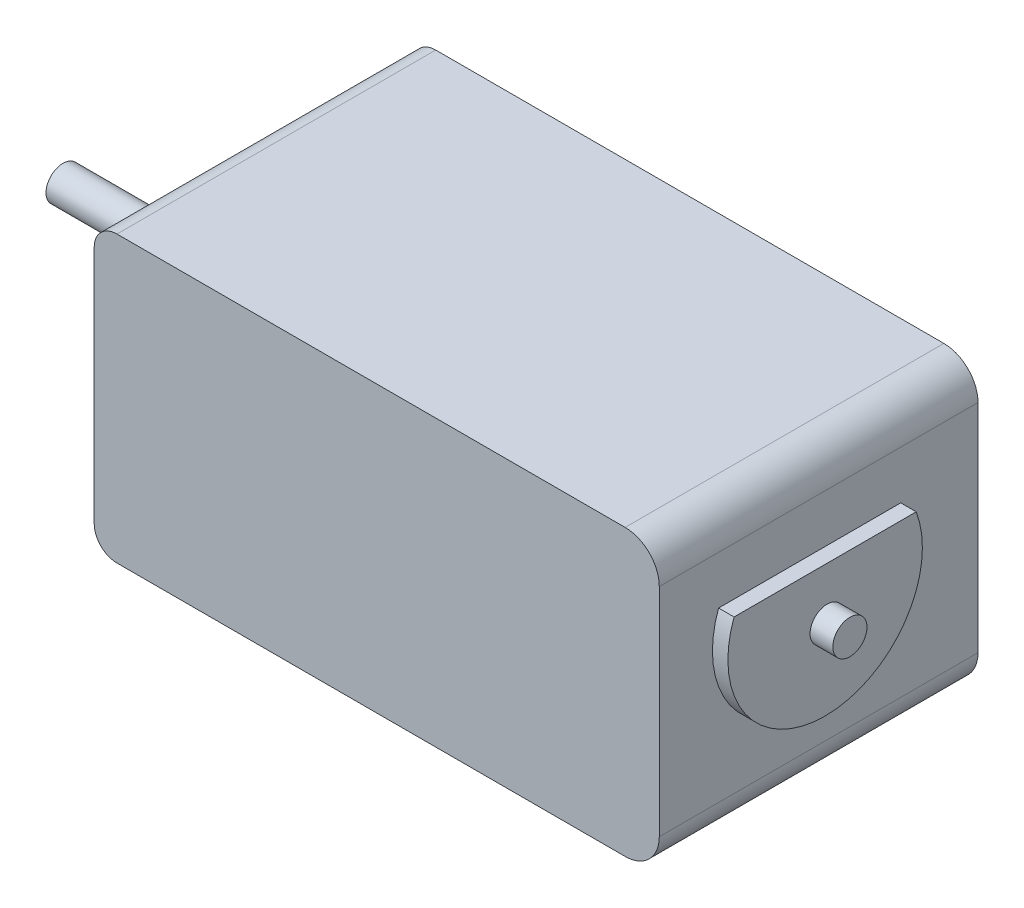
ISO-10303-21;
HEADER;
FILE_DESCRIPTION(('STEP AP214'),'2;1');
FILE_NAME('part.step','',(''),(''),'','','');
FILE_SCHEMA(('AUTOMOTIVE_DESIGN { 1 0 10303 214 1 1 1 1 }'));
ENDSEC;
DATA;
#1=APPLICATION_CONTEXT('core data for automotive mechanical design processes');
#2=APPLICATION_PROTOCOL_DEFINITION('international standard','automotive_design',2000,#1);
#3=PRODUCT_CONTEXT('',#1,'mechanical');
#4=PRODUCT('Part','Part','',(#3));
#5=PRODUCT_RELATED_PRODUCT_CATEGORY('part','',(#4));
#6=PRODUCT_DEFINITION_FORMATION('','',#4);
#7=PRODUCT_DEFINITION_CONTEXT('part definition',#1,'design');
#8=PRODUCT_DEFINITION('design','',#6,#7);
#9=PRODUCT_DEFINITION_SHAPE('','',#8);
#10=(LENGTH_UNIT() NAMED_UNIT(*) SI_UNIT(.MILLI.,.METRE.));
#11=(NAMED_UNIT(*) PLANE_ANGLE_UNIT() SI_UNIT($,.RADIAN.));
#12=(NAMED_UNIT(*) SI_UNIT($,.STERADIAN.) SOLID_ANGLE_UNIT());
#13=UNCERTAINTY_MEASURE_WITH_UNIT(LENGTH_MEASURE(1.E-05),#10,'distance_accuracy_value','');
#14=(GEOMETRIC_REPRESENTATION_CONTEXT(3) GLOBAL_UNCERTAINTY_ASSIGNED_CONTEXT((#13)) GLOBAL_UNIT_ASSIGNED_CONTEXT((#10,
#11,#12)) REPRESENTATION_CONTEXT('',''));
#15=CARTESIAN_POINT('',(0.,0.,0.));
#16=DIRECTION('',(0.,0.,1.));
#17=DIRECTION('',(1.,0.,0.));
#18=AXIS2_PLACEMENT_3D('',#15,#16,#17);
#19=CARTESIAN_POINT('',(24.8208983265812,-1.5,14.));
#20=DIRECTION('',(-1.,0.,0.));
#21=DIRECTION('',(0.,0.,1.));
#22=AXIS2_PLACEMENT_3D('',#19,#20,#21);
#23=PLANE('',#22);
#24=DIRECTION('',(0.,1.,0.));
#25=VECTOR('',#24,1.);
#26=CARTESIAN_POINT('',(24.8208983265812,-1.5,0.));
#27=LINE('',#26,#25);
#28=CARTESIAN_POINT('',(24.8208983265812,-11.0169927155581,0.));
#29=VERTEX_POINT('',#28);
#30=CARTESIAN_POINT('',(24.8208983265812,-1.5,0.));
#31=VERTEX_POINT('',#30);
#32=EDGE_CURVE('E134',#29,#31,#27,.T.);
#33=ORIENTED_EDGE('',*,*,#32,.T.);
#34=DIRECTION('',(0.,0.,-1.));
#35=VECTOR('',#34,1.);
#36=CARTESIAN_POINT('',(24.8208983265812,-1.5,14.));
#37=LINE('',#36,#35);
#38=CARTESIAN_POINT('',(24.8208983265812,-1.5,14.));
#39=VERTEX_POINT('',#38);
#40=EDGE_CURVE('E131',#39,#31,#37,.T.);
#41=ORIENTED_EDGE('',*,*,#40,.F.);
#42=DIRECTION('',(0.,1.,0.));
#43=VECTOR('',#42,1.);
#44=CARTESIAN_POINT('',(24.8208983265812,-1.5,14.));
#45=LINE('',#44,#43);
#46=CARTESIAN_POINT('',(24.8208983265812,-11.0169927155581,14.));
#47=VERTEX_POINT('',#46);
#48=EDGE_CURVE('E118',#47,#39,#45,.T.);
#49=ORIENTED_EDGE('',*,*,#48,.F.);
#50=DIRECTION('',(0.,0.,-1.));
#51=VECTOR('',#50,1.);
#52=CARTESIAN_POINT('',(24.8208983265812,-11.0169927155581,14.));
#53=LINE('',#52,#51);
#54=EDGE_CURVE('E137',#47,#29,#53,.T.);
#55=ORIENTED_EDGE('',*,*,#54,.T.);
#56=EDGE_LOOP('',(#33,#41,#49,#55));
#57=FACE_BOUND('',#56,.T.);
#58=CARTESIAN_POINT('',(24.8208983265812,-5.11818006161583,7.39390366159449));
#59=DIRECTION('',(-1.,0.,0.));
#60=DIRECTION('',(0.,0.,1.));
#61=AXIS2_PLACEMENT_3D('',#58,#59,#60);
#62=CIRCLE('',#61,4.271792058218);
#63=CARTESIAN_POINT('',(24.8208983265812,-3.62022901041665,11.3944473792491));
#64=VERTEX_POINT('',#63);
#65=CARTESIAN_POINT('',(24.8208983265812,-3.62022901041665,3.3933599439399));
#66=VERTEX_POINT('',#65);
#67=EDGE_CURVE('E12',#64,#66,#62,.F.);
#68=ORIENTED_EDGE('',*,*,#67,.F.);
#69=DIRECTION('',(0.,0.,-1.));
#70=VECTOR('',#69,1.);
#71=CARTESIAN_POINT('',(24.8208983265812,-3.62022901041665,14.));
#72=LINE('',#71,#70);
#73=EDGE_CURVE('E46',#64,#66,#72,.T.);
#74=ORIENTED_EDGE('',*,*,#73,.T.);
#75=EDGE_LOOP('',(#68,#74));
#76=FACE_BOUND('',#75,.T.);
#77=ADVANCED_FACE('F38',(#57,#76),#23,.F.);
#78=CARTESIAN_POINT('',(1.,-1.,14.));
#79=DIRECTION('',(0.,0.,-1.));
#80=DIRECTION('',(-1.,0.,0.));
#81=AXIS2_PLACEMENT_3D('',#78,#79,#80);
#82=CYLINDRICAL_SURFACE('',#81,1.);
#83=CARTESIAN_POINT('',(1.,-1.,0.));
#84=DIRECTION('',(0.,0.,1.));
#85=DIRECTION('',(-1.,0.,0.));
#86=AXIS2_PLACEMENT_3D('',#83,#84,#85);
#87=CIRCLE('',#86,1.);
#88=CARTESIAN_POINT('',(1.00000000000001,0.,0.));
#89=VERTEX_POINT('',#88);
#90=CARTESIAN_POINT('',(0.,-1.00000000000001,0.));
#91=VERTEX_POINT('',#90);
#92=EDGE_CURVE('E146',#89,#91,#87,.T.);
#93=ORIENTED_EDGE('',*,*,#92,.T.);
#94=DIRECTION('',(0.,0.,-1.));
#95=VECTOR('',#94,1.);
#96=CARTESIAN_POINT('',(0.,-1.00000000000001,14.));
#97=LINE('',#96,#95);
#98=CARTESIAN_POINT('',(0.,-1.00000000000001,14.));
#99=VERTEX_POINT('',#98);
#100=EDGE_CURVE('E175',#99,#91,#97,.T.);
#101=ORIENTED_EDGE('',*,*,#100,.F.);
#102=CARTESIAN_POINT('',(1.,-1.,14.));
#103=DIRECTION('',(0.,0.,1.));
#104=DIRECTION('',(-1.,0.,0.));
#105=AXIS2_PLACEMENT_3D('',#102,#103,#104);
#106=CIRCLE('',#105,1.);
#107=CARTESIAN_POINT('',(1.00000000000001,0.,14.));
#108=VERTEX_POINT('',#107);
#109=EDGE_CURVE('E162',#108,#99,#106,.T.);
#110=ORIENTED_EDGE('',*,*,#109,.F.);
#111=DIRECTION('',(0.,0.,-1.));
#112=VECTOR('',#111,1.);
#113=CARTESIAN_POINT('',(1.00000000000001,0.,14.));
#114=LINE('',#113,#112);
#115=EDGE_CURVE('E142',#108,#89,#114,.T.);
#116=ORIENTED_EDGE('',*,*,#115,.T.);
#117=EDGE_LOOP('',(#93,#101,#110,#116));
#118=FACE_BOUND('',#117,.T.);
#119=ADVANCED_FACE('F40',(#118),#82,.T.);
#120=CARTESIAN_POINT('',(0.,-1.00000000000001,14.));
#121=DIRECTION('',(1.,0.,0.));
#122=DIRECTION('',(0.,0.,-1.));
#123=AXIS2_PLACEMENT_3D('',#120,#121,#122);
#124=PLANE('',#123);
#125=CARTESIAN_POINT('',(0.,-5.87228384255916,7.36782144306665));
#126=DIRECTION('',(1.,0.,0.));
#127=DIRECTION('',(0.,0.,-1.));
#128=AXIS2_PLACEMENT_3D('',#125,#126,#127);
#129=CIRCLE('',#128,2.5);
#130=CARTESIAN_POINT('',(0.,-5.87228384255916,4.86782144306665));
#131=VERTEX_POINT('',#130);
#132=EDGE_CURVE('E207',#131,#131,#129,.T.);
#133=ORIENTED_EDGE('',*,*,#132,.T.);
#134=EDGE_LOOP('',(#133));
#135=FACE_BOUND('',#134,.T.);
#136=DIRECTION('',(0.,-1.,0.));
#137=VECTOR('',#136,1.);
#138=CARTESIAN_POINT('',(0.,-1.00000000000001,0.));
#139=LINE('',#138,#137);
#140=CARTESIAN_POINT('',(0.,-11.5169927155581,0.));
#141=VERTEX_POINT('',#140);
#142=EDGE_CURVE('E149',#91,#141,#139,.T.);
#143=ORIENTED_EDGE('',*,*,#142,.T.);
#144=DIRECTION('',(0.,0.,-1.));
#145=VECTOR('',#144,1.);
#146=CARTESIAN_POINT('',(0.,-11.5169927155581,14.));
#147=LINE('',#146,#145);
#148=CARTESIAN_POINT('',(0.,-11.5169927155581,14.));
#149=VERTEX_POINT('',#148);
#150=EDGE_CURVE('E172',#149,#141,#147,.T.);
#151=ORIENTED_EDGE('',*,*,#150,.F.);
#152=DIRECTION('',(0.,-1.,0.));
#153=VECTOR('',#152,1.);
#154=CARTESIAN_POINT('',(0.,-1.00000000000001,14.));
#155=LINE('',#154,#153);
#156=EDGE_CURVE('E103',#99,#149,#155,.T.);
#157=ORIENTED_EDGE('',*,*,#156,.F.);
#158=ORIENTED_EDGE('',*,*,#100,.T.);
#159=EDGE_LOOP('',(#143,#151,#157,#158));
#160=FACE_BOUND('',#159,.T.);
#161=ADVANCED_FACE('F234',(#135,#160),#124,.F.);
#162=CARTESIAN_POINT('',(1.,-11.5169927155581,14.));
#163=DIRECTION('',(0.,0.,-1.));
#164=DIRECTION('',(-1.,0.,0.));
#165=AXIS2_PLACEMENT_3D('',#162,#163,#164);
#166=CYLINDRICAL_SURFACE('',#165,1.);
#167=CARTESIAN_POINT('',(1.,-11.5169927155581,0.));
#168=DIRECTION('',(0.,0.,1.));
#169=DIRECTION('',(-1.,0.,0.));
#170=AXIS2_PLACEMENT_3D('',#167,#168,#169);
#171=CIRCLE('',#170,1.);
#172=CARTESIAN_POINT('',(1.00000000000001,-12.5169927155581,0.));
#173=VERTEX_POINT('',#172);
#174=EDGE_CURVE('E152',#141,#173,#171,.T.);
#175=ORIENTED_EDGE('',*,*,#174,.T.);
#176=DIRECTION('',(0.,0.,-1.));
#177=VECTOR('',#176,1.);
#178=CARTESIAN_POINT('',(1.00000000000001,-12.5169927155581,14.));
#179=LINE('',#178,#177);
#180=CARTESIAN_POINT('',(1.00000000000001,-12.5169927155581,14.));
#181=VERTEX_POINT('',#180);
#182=EDGE_CURVE('E169',#181,#173,#179,.T.);
#183=ORIENTED_EDGE('',*,*,#182,.F.);
#184=CARTESIAN_POINT('',(1.,-11.5169927155581,14.));
#185=DIRECTION('',(0.,0.,1.));
#186=DIRECTION('',(-1.,0.,0.));
#187=AXIS2_PLACEMENT_3D('',#184,#185,#186);
#188=CIRCLE('',#187,1.);
#189=EDGE_CURVE('E214',#149,#181,#188,.T.);
#190=ORIENTED_EDGE('',*,*,#189,.F.);
#191=ORIENTED_EDGE('',*,*,#150,.T.);
#192=EDGE_LOOP('',(#175,#183,#190,#191));
#193=FACE_BOUND('',#192,.T.);
#194=ADVANCED_FACE('F237',(#193),#166,.T.);
#195=CARTESIAN_POINT('',(1.00000000000001,-12.5169927155581,14.));
#196=DIRECTION('',(0.,1.,0.));
#197=DIRECTION('',(-1.,0.,0.));
#198=AXIS2_PLACEMENT_3D('',#195,#196,#197);
#199=PLANE('',#198);
#200=DIRECTION('',(1.,0.,0.));
#201=VECTOR('',#200,1.);
#202=CARTESIAN_POINT('',(1.00000000000001,-12.5169927155581,0.));
#203=LINE('',#202,#201);
#204=CARTESIAN_POINT('',(23.3208983265812,-12.5169927155581,0.));
#205=VERTEX_POINT('',#204);
#206=EDGE_CURVE('E154',#173,#205,#203,.T.);
#207=ORIENTED_EDGE('',*,*,#206,.T.);
#208=DIRECTION('',(0.,0.,-1.));
#209=VECTOR('',#208,1.);
#210=CARTESIAN_POINT('',(23.3208983265812,-12.5169927155581,14.));
#211=LINE('',#210,#209);
#212=CARTESIAN_POINT('',(23.3208983265812,-12.5169927155581,14.));
#213=VERTEX_POINT('',#212);
#214=EDGE_CURVE('E166',#213,#205,#211,.T.);
#215=ORIENTED_EDGE('',*,*,#214,.F.);
#216=DIRECTION('',(1.,0.,0.));
#217=VECTOR('',#216,1.);
#218=CARTESIAN_POINT('',(1.00000000000001,-12.5169927155581,14.));
#219=LINE('',#218,#217);
#220=EDGE_CURVE('E216',#181,#213,#219,.T.);
#221=ORIENTED_EDGE('',*,*,#220,.F.);
#222=ORIENTED_EDGE('',*,*,#182,.T.);
#223=EDGE_LOOP('',(#207,#215,#221,#222));
#224=FACE_BOUND('',#223,.T.);
#225=ADVANCED_FACE('F222',(#224),#199,.F.);
#226=CARTESIAN_POINT('',(23.3208983265812,-11.0169927155581,14.));
#227=DIRECTION('',(0.,0.,-1.));
#228=DIRECTION('',(-1.,0.,0.));
#229=AXIS2_PLACEMENT_3D('',#226,#227,#228);
#230=CYLINDRICAL_SURFACE('',#229,1.5);
#231=CARTESIAN_POINT('',(23.3208983265812,-11.0169927155581,0.));
#232=DIRECTION('',(0.,0.,1.));
#233=DIRECTION('',(1.,0.,0.));
#234=AXIS2_PLACEMENT_3D('',#231,#232,#233);
#235=CIRCLE('',#234,1.5);
#236=EDGE_CURVE('E156',#205,#29,#235,.T.);
#237=ORIENTED_EDGE('',*,*,#236,.T.);
#238=ORIENTED_EDGE('',*,*,#54,.F.);
#239=CARTESIAN_POINT('',(23.3208983265812,-11.0169927155581,14.));
#240=DIRECTION('',(0.,0.,1.));
#241=DIRECTION('',(1.,0.,0.));
#242=AXIS2_PLACEMENT_3D('',#239,#240,#241);
#243=CIRCLE('',#242,1.5);
#244=EDGE_CURVE('E125',#213,#47,#243,.T.);
#245=ORIENTED_EDGE('',*,*,#244,.F.);
#246=ORIENTED_EDGE('',*,*,#214,.T.);
#247=EDGE_LOOP('',(#237,#238,#245,#246));
#248=FACE_BOUND('',#247,.T.);
#249=ADVANCED_FACE('F226',(#248),#230,.T.);
#250=CARTESIAN_POINT('',(23.3208983265812,-1.5,14.));
#251=DIRECTION('',(0.,0.,-1.));
#252=DIRECTION('',(-1.,0.,0.));
#253=AXIS2_PLACEMENT_3D('',#250,#251,#252);
#254=CYLINDRICAL_SURFACE('',#253,1.5);
#255=CARTESIAN_POINT('',(23.3208983265812,-1.5,0.));
#256=DIRECTION('',(0.,0.,1.));
#257=DIRECTION('',(1.,0.,0.));
#258=AXIS2_PLACEMENT_3D('',#255,#256,#257);
#259=CIRCLE('',#258,1.5);
#260=CARTESIAN_POINT('',(23.3208983265812,0.,0.));
#261=VERTEX_POINT('',#260);
#262=EDGE_CURVE('E159',#31,#261,#259,.T.);
#263=ORIENTED_EDGE('',*,*,#262,.T.);
#264=DIRECTION('',(0.,0.,-1.));
#265=VECTOR('',#264,1.);
#266=CARTESIAN_POINT('',(23.3208983265812,0.,14.));
#267=LINE('',#266,#265);
#268=CARTESIAN_POINT('',(23.3208983265812,0.,14.));
#269=VERTEX_POINT('',#268);
#270=EDGE_CURVE('E138',#269,#261,#267,.T.);
#271=ORIENTED_EDGE('',*,*,#270,.F.);
#272=CARTESIAN_POINT('',(23.3208983265812,-1.5,14.));
#273=DIRECTION('',(0.,0.,1.));
#274=DIRECTION('',(1.,0.,0.));
#275=AXIS2_PLACEMENT_3D('',#272,#273,#274);
#276=CIRCLE('',#275,1.5);
#277=EDGE_CURVE('E122',#39,#269,#276,.T.);
#278=ORIENTED_EDGE('',*,*,#277,.F.);
#279=ORIENTED_EDGE('',*,*,#40,.T.);
#280=EDGE_LOOP('',(#263,#271,#278,#279));
#281=FACE_BOUND('',#280,.T.);
#282=ADVANCED_FACE('F140',(#281),#254,.T.);
#283=CARTESIAN_POINT('',(1.00000000000001,0.,14.));
#284=DIRECTION('',(0.,-1.,0.));
#285=DIRECTION('',(0.,0.,-1.));
#286=AXIS2_PLACEMENT_3D('',#283,#284,#285);
#287=PLANE('',#286);
#288=DIRECTION('',(-1.,0.,0.));
#289=VECTOR('',#288,1.);
#290=CARTESIAN_POINT('',(1.00000000000001,0.,0.));
#291=LINE('',#290,#289);
#292=EDGE_CURVE('E94',#261,#89,#291,.T.);
#293=ORIENTED_EDGE('',*,*,#292,.T.);
#294=ORIENTED_EDGE('',*,*,#115,.F.);
#295=DIRECTION('',(-1.,0.,0.));
#296=VECTOR('',#295,1.);
#297=CARTESIAN_POINT('',(1.00000000000001,0.,14.));
#298=LINE('',#297,#296);
#299=EDGE_CURVE('E61',#269,#108,#298,.T.);
#300=ORIENTED_EDGE('',*,*,#299,.F.);
#301=ORIENTED_EDGE('',*,*,#270,.T.);
#302=EDGE_LOOP('',(#293,#294,#300,#301));
#303=FACE_BOUND('',#302,.T.);
#304=ADVANCED_FACE('F230',(#303),#287,.F.);
#305=CARTESIAN_POINT('',(1.,-1.,14.));
#306=DIRECTION('',(0.,0.,-1.));
#307=DIRECTION('',(-1.,0.,0.));
#308=AXIS2_PLACEMENT_3D('',#305,#306,#307);
#309=PLANE('',#308);
#310=ORIENTED_EDGE('',*,*,#109,.T.);
#311=ORIENTED_EDGE('',*,*,#156,.T.);
#312=ORIENTED_EDGE('',*,*,#189,.T.);
#313=ORIENTED_EDGE('',*,*,#220,.T.);
#314=ORIENTED_EDGE('',*,*,#244,.T.);
#315=ORIENTED_EDGE('',*,*,#48,.T.);
#316=ORIENTED_EDGE('',*,*,#277,.T.);
#317=ORIENTED_EDGE('',*,*,#299,.T.);
#318=EDGE_LOOP('',(#310,#311,#312,#313,#314,#315,#316,#317));
#319=FACE_BOUND('',#318,.T.);
#320=ADVANCED_FACE('F120',(#319),#309,.F.);
#321=CARTESIAN_POINT('',(1.,-1.,0.));
#322=DIRECTION('',(0.,0.,-1.));
#323=DIRECTION('',(-1.,0.,0.));
#324=AXIS2_PLACEMENT_3D('',#321,#322,#323);
#325=PLANE('',#324);
#326=ORIENTED_EDGE('',*,*,#92,.F.);
#327=ORIENTED_EDGE('',*,*,#292,.F.);
#328=ORIENTED_EDGE('',*,*,#262,.F.);
#329=ORIENTED_EDGE('',*,*,#32,.F.);
#330=ORIENTED_EDGE('',*,*,#236,.F.);
#331=ORIENTED_EDGE('',*,*,#206,.F.);
#332=ORIENTED_EDGE('',*,*,#174,.F.);
#333=ORIENTED_EDGE('',*,*,#142,.F.);
#334=EDGE_LOOP('',(#326,#327,#328,#329,#330,#331,#332,#333));
#335=FACE_BOUND('',#334,.T.);
#336=ADVANCED_FACE('F229',(#335),#325,.T.);
#337=CARTESIAN_POINT('',(-1.5,-5.87228384255916,7.36782144306665));
#338=DIRECTION('',(1.,0.,0.));
#339=DIRECTION('',(0.,0.,-1.));
#340=AXIS2_PLACEMENT_3D('',#337,#338,#339);
#341=CYLINDRICAL_SURFACE('',#340,2.5);
#342=CARTESIAN_POINT('',(-1.5,-5.87228384255916,7.36782144306665));
#343=DIRECTION('',(1.,0.,0.));
#344=DIRECTION('',(0.,0.,-1.));
#345=AXIS2_PLACEMENT_3D('',#342,#343,#344);
#346=CIRCLE('',#345,2.5);
#347=CARTESIAN_POINT('',(-1.5,-5.87228384255916,4.86782144306665));
#348=VERTEX_POINT('',#347);
#349=EDGE_CURVE('E150',#348,#348,#346,.T.);
#350=ORIENTED_EDGE('',*,*,#349,.T.);
#351=EDGE_LOOP('',(#350));
#352=FACE_BOUND('',#351,.T.);
#353=ORIENTED_EDGE('',*,*,#132,.F.);
#354=EDGE_LOOP('',(#353));
#355=FACE_BOUND('',#354,.T.);
#356=ADVANCED_FACE('F268',(#352,#355),#341,.T.);
#357=CARTESIAN_POINT('',(-1.5,-5.87228384255916,7.36782144306665));
#358=DIRECTION('',(1.,0.,0.));
#359=DIRECTION('',(0.,0.,-1.));
#360=AXIS2_PLACEMENT_3D('',#357,#358,#359);
#361=PLANE('',#360);
#362=CARTESIAN_POINT('',(-1.5,-5.87228384255916,7.36782144306665));
#363=DIRECTION('',(1.,0.,0.));
#364=DIRECTION('',(0.,0.,-1.));
#365=AXIS2_PLACEMENT_3D('',#362,#363,#364);
#366=CIRCLE('',#365,2.25);
#367=CARTESIAN_POINT('',(-1.5,-5.87228384255916,5.11782144306665));
#368=VERTEX_POINT('',#367);
#369=EDGE_CURVE('E204',#368,#368,#366,.T.);
#370=ORIENTED_EDGE('',*,*,#369,.T.);
#371=EDGE_LOOP('',(#370));
#372=FACE_BOUND('',#371,.T.);
#373=ORIENTED_EDGE('',*,*,#349,.F.);
#374=EDGE_LOOP('',(#373));
#375=FACE_BOUND('',#374,.T.);
#376=ADVANCED_FACE('F272',(#372,#375),#361,.F.);
#377=CARTESIAN_POINT('',(-1.5,-5.87228384255916,7.36782144306665));
#378=DIRECTION('',(1.,0.,0.));
#379=DIRECTION('',(0.,0.,-1.));
#380=AXIS2_PLACEMENT_3D('',#377,#378,#379);
#381=CYLINDRICAL_SURFACE('',#380,2.25);
#382=ORIENTED_EDGE('',*,*,#369,.F.);
#383=EDGE_LOOP('',(#382));
#384=FACE_BOUND('',#383,.T.);
#385=CARTESIAN_POINT('',(0.,-5.87228384255916,7.36782144306665));
#386=DIRECTION('',(1.,0.,0.));
#387=DIRECTION('',(0.,0.,-1.));
#388=AXIS2_PLACEMENT_3D('',#385,#386,#387);
#389=CIRCLE('',#388,2.25);
#390=CARTESIAN_POINT('',(0.,-5.87228384255916,5.11782144306665));
#391=VERTEX_POINT('',#390);
#392=EDGE_CURVE('E177',#391,#391,#389,.T.);
#393=ORIENTED_EDGE('',*,*,#392,.T.);
#394=EDGE_LOOP('',(#393));
#395=FACE_BOUND('',#394,.T.);
#396=ADVANCED_FACE('F276',(#384,#395),#381,.F.);
#397=CARTESIAN_POINT('',(0.,-5.87228384255916,7.36782144306665));
#398=DIRECTION('',(1.,0.,0.));
#399=DIRECTION('',(0.,0.,-1.));
#400=AXIS2_PLACEMENT_3D('',#397,#398,#399);
#401=CIRCLE('',#400,0.75);
#402=CARTESIAN_POINT('',(0.,-5.87228384255916,6.61782144306664));
#403=VERTEX_POINT('',#402);
#404=EDGE_CURVE('E180',#403,#403,#401,.F.);
#405=ORIENTED_EDGE('',*,*,#404,.F.);
#406=EDGE_LOOP('',(#405));
#407=FACE_BOUND('',#406,.T.);
#408=ORIENTED_EDGE('',*,*,#392,.F.);
#409=EDGE_LOOP('',(#408));
#410=FACE_BOUND('',#409,.T.);
#411=ADVANCED_FACE('F246',(#407,#410),#124,.F.);
#412=CARTESIAN_POINT('',(-8.,-5.87228384255916,7.36782144306665));
#413=DIRECTION('',(1.,0.,0.));
#414=DIRECTION('',(0.,0.,-1.));
#415=AXIS2_PLACEMENT_3D('',#412,#413,#414);
#416=CYLINDRICAL_SURFACE('',#415,0.75);
#417=CARTESIAN_POINT('',(-8.,-5.87228384255916,7.36782144306665));
#418=DIRECTION('',(-1.,0.,0.));
#419=DIRECTION('',(0.,0.,1.));
#420=AXIS2_PLACEMENT_3D('',#417,#418,#419);
#421=CIRCLE('',#420,0.75);
#422=CARTESIAN_POINT('',(-8.,-5.87228384255916,8.11782144306665));
#423=VERTEX_POINT('',#422);
#424=EDGE_CURVE('E197',#423,#423,#421,.T.);
#425=ORIENTED_EDGE('',*,*,#424,.F.);
#426=EDGE_LOOP('',(#425));
#427=FACE_BOUND('',#426,.T.);
#428=ORIENTED_EDGE('',*,*,#404,.T.);
#429=EDGE_LOOP('',(#428));
#430=FACE_BOUND('',#429,.T.);
#431=ADVANCED_FACE('F281',(#427,#430),#416,.T.);
#432=CARTESIAN_POINT('',(-8.,-5.87228384255916,7.36782144306665));
#433=DIRECTION('',(-1.,0.,0.));
#434=DIRECTION('',(0.,0.,1.));
#435=AXIS2_PLACEMENT_3D('',#432,#433,#434);
#436=PLANE('',#435);
#437=ORIENTED_EDGE('',*,*,#424,.T.);
#438=EDGE_LOOP('',(#437));
#439=FACE_BOUND('',#438,.T.);
#440=ADVANCED_FACE('F284',(#439),#436,.T.);
#441=CARTESIAN_POINT('',(25.5,-5.11818006161583,7.39390366159449));
#442=DIRECTION('',(-1.,0.,0.));
#443=DIRECTION('',(0.,0.,1.));
#444=AXIS2_PLACEMENT_3D('',#441,#442,#443);
#445=CYLINDRICAL_SURFACE('',#444,4.271792058218);
#446=DIRECTION('',(-1.,0.,0.));
#447=VECTOR('',#446,1.);
#448=CARTESIAN_POINT('',(25.5,-3.62022901041665,11.3944473792491));
#449=LINE('',#448,#447);
#450=CARTESIAN_POINT('',(25.5,-3.62022901041665,11.3944473792491));
#451=VERTEX_POINT('',#450);
#452=EDGE_CURVE('E188',#451,#64,#449,.T.);
#453=ORIENTED_EDGE('',*,*,#452,.T.);
#454=ORIENTED_EDGE('',*,*,#67,.T.);
#455=DIRECTION('',(-1.,0.,0.));
#456=VECTOR('',#455,1.);
#457=CARTESIAN_POINT('',(25.5,-3.62022901041665,3.3933599439399));
#458=LINE('',#457,#456);
#459=CARTESIAN_POINT('',(25.5,-3.62022901041665,3.3933599439399));
#460=VERTEX_POINT('',#459);
#461=EDGE_CURVE('E53',#460,#66,#458,.T.);
#462=ORIENTED_EDGE('',*,*,#461,.F.);
#463=CARTESIAN_POINT('',(25.5,-5.11818006161583,7.39390366159449));
#464=DIRECTION('',(1.,0.,0.));
#465=DIRECTION('',(0.,0.,-1.));
#466=AXIS2_PLACEMENT_3D('',#463,#464,#465);
#467=CIRCLE('',#466,4.271792058218);
#468=EDGE_CURVE('E193',#451,#460,#467,.T.);
#469=ORIENTED_EDGE('',*,*,#468,.F.);
#470=EDGE_LOOP('',(#453,#454,#462,#469));
#471=FACE_BOUND('',#470,.T.);
#472=ADVANCED_FACE('F191',(#471),#445,.T.);
#473=CARTESIAN_POINT('',(25.5,-3.62022901041665,11.3944473792491));
#474=DIRECTION('',(0.,1.,0.));
#475=DIRECTION('',(0.,0.,1.));
#476=AXIS2_PLACEMENT_3D('',#473,#474,#475);
#477=PLANE('',#476);
#478=ORIENTED_EDGE('',*,*,#73,.F.);
#479=ORIENTED_EDGE('',*,*,#452,.F.);
#480=DIRECTION('',(0.,0.,-1.));
#481=VECTOR('',#480,1.);
#482=CARTESIAN_POINT('',(25.5,-3.62022901041665,11.3944473792491));
#483=LINE('',#482,#481);
#484=EDGE_CURVE('E195',#451,#460,#483,.T.);
#485=ORIENTED_EDGE('',*,*,#484,.T.);
#486=ORIENTED_EDGE('',*,*,#461,.T.);
#487=EDGE_LOOP('',(#478,#479,#485,#486));
#488=FACE_BOUND('',#487,.T.);
#489=ADVANCED_FACE('F186',(#488),#477,.T.);
#490=CARTESIAN_POINT('',(25.5,-5.11818006161583,7.39390366159449));
#491=DIRECTION('',(1.,0.,0.));
#492=DIRECTION('',(0.,0.,-1.));
#493=AXIS2_PLACEMENT_3D('',#490,#491,#492);
#494=PLANE('',#493);
#495=CARTESIAN_POINT('',(25.5,-5.92614704310535,7.30590965609679));
#496=DIRECTION('',(1.,0.,0.));
#497=DIRECTION('',(0.,0.,-1.));
#498=AXIS2_PLACEMENT_3D('',#495,#496,#497);
#499=CIRCLE('',#498,0.75);
#500=CARTESIAN_POINT('',(25.5,-5.92614704310535,6.55590965609679));
#501=VERTEX_POINT('',#500);
#502=EDGE_CURVE('E309',#501,#501,#499,.T.);
#503=ORIENTED_EDGE('',*,*,#502,.F.);
#504=EDGE_LOOP('',(#503));
#505=FACE_BOUND('',#504,.T.);
#506=ORIENTED_EDGE('',*,*,#468,.T.);
#507=ORIENTED_EDGE('',*,*,#484,.F.);
#508=EDGE_LOOP('',(#506,#507));
#509=FACE_BOUND('',#508,.T.);
#510=ADVANCED_FACE('F293',(#505,#509),#494,.T.);
#511=CARTESIAN_POINT('',(26.5,-5.92614704310535,7.30590965609679));
#512=DIRECTION('',(-1.,0.,0.));
#513=DIRECTION('',(0.,0.,1.));
#514=AXIS2_PLACEMENT_3D('',#511,#512,#513);
#515=CYLINDRICAL_SURFACE('',#514,0.75);
#516=CARTESIAN_POINT('',(26.5,-5.92614704310535,7.30590965609679));
#517=DIRECTION('',(1.,0.,0.));
#518=DIRECTION('',(0.,0.,-1.));
#519=AXIS2_PLACEMENT_3D('',#516,#517,#518);
#520=CIRCLE('',#519,0.75);
#521=CARTESIAN_POINT('',(26.5,-5.92614704310535,6.55590965609679));
#522=VERTEX_POINT('',#521);
#523=EDGE_CURVE('E308',#522,#522,#520,.T.);
#524=ORIENTED_EDGE('',*,*,#523,.F.);
#525=EDGE_LOOP('',(#524));
#526=FACE_BOUND('',#525,.T.);
#527=ORIENTED_EDGE('',*,*,#502,.T.);
#528=EDGE_LOOP('',(#527));
#529=FACE_BOUND('',#528,.T.);
#530=ADVANCED_FACE('F296',(#526,#529),#515,.T.);
#531=CARTESIAN_POINT('',(26.5,-5.92614704310535,7.30590965609679));
#532=DIRECTION('',(1.,0.,0.));
#533=DIRECTION('',(0.,0.,-1.));
#534=AXIS2_PLACEMENT_3D('',#531,#532,#533);
#535=PLANE('',#534);
#536=ORIENTED_EDGE('',*,*,#523,.T.);
#537=EDGE_LOOP('',(#536));
#538=FACE_BOUND('',#537,.T.);
#539=ADVANCED_FACE('F300',(#538),#535,.T.);
#540=CLOSED_SHELL('',(#77,#119,#161,#194,#225,#249,#282,#304,#320,#336,#356,#376,#396,#411,#431,
#440,#472,#489,#510,#530,#539));
#541=MANIFOLD_SOLID_BREP('B2',#540);
#542=ADVANCED_BREP_SHAPE_REPRESENTATION('',(#18,#541),#14);
#543=SHAPE_DEFINITION_REPRESENTATION(#9,#542);
ENDSEC;
END-ISO-10303-21;
